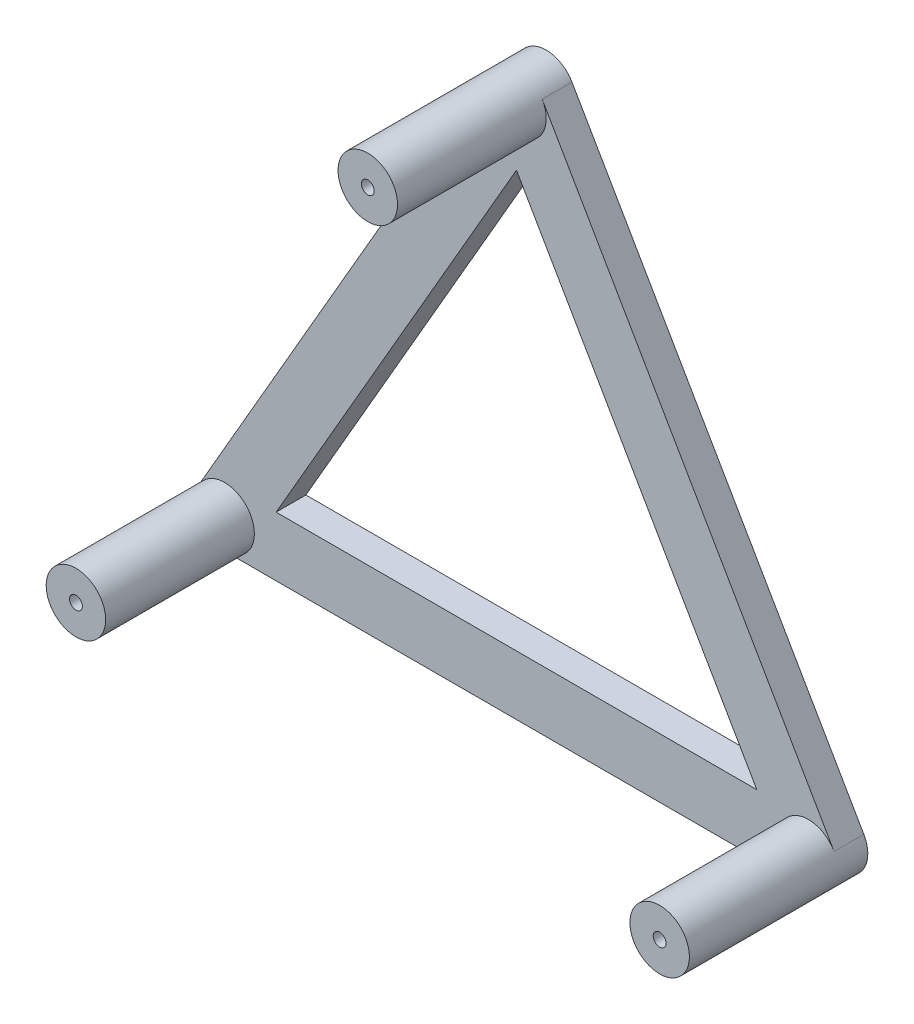
ISO-10303-21;
HEADER;
FILE_DESCRIPTION(('STEP AP214'),'2;1');
FILE_NAME('part.step','',(''),(''),'','','');
FILE_SCHEMA(('AUTOMOTIVE_DESIGN { 1 0 10303 214 1 1 1 1 }'));
ENDSEC;
DATA;
#1=APPLICATION_CONTEXT('core data for automotive mechanical design processes');
#2=APPLICATION_PROTOCOL_DEFINITION('international standard','automotive_design',2000,#1);
#3=PRODUCT_CONTEXT('',#1,'mechanical');
#4=PRODUCT('Part','Part','',(#3));
#5=PRODUCT_RELATED_PRODUCT_CATEGORY('part','',(#4));
#6=PRODUCT_DEFINITION_FORMATION('','',#4);
#7=PRODUCT_DEFINITION_CONTEXT('part definition',#1,'design');
#8=PRODUCT_DEFINITION('design','',#6,#7);
#9=PRODUCT_DEFINITION_SHAPE('','',#8);
#10=(LENGTH_UNIT() NAMED_UNIT(*) SI_UNIT(.MILLI.,.METRE.));
#11=(NAMED_UNIT(*) PLANE_ANGLE_UNIT() SI_UNIT($,.RADIAN.));
#12=(NAMED_UNIT(*) SI_UNIT($,.STERADIAN.) SOLID_ANGLE_UNIT());
#13=UNCERTAINTY_MEASURE_WITH_UNIT(LENGTH_MEASURE(1.E-05),#10,'distance_accuracy_value','');
#14=(GEOMETRIC_REPRESENTATION_CONTEXT(3) GLOBAL_UNCERTAINTY_ASSIGNED_CONTEXT((#13)) GLOBAL_UNIT_ASSIGNED_CONTEXT((#10,
#11,#12)) REPRESENTATION_CONTEXT('',''));
#15=CARTESIAN_POINT('',(0.,0.,0.));
#16=DIRECTION('',(0.,0.,1.));
#17=DIRECTION('',(1.,0.,0.));
#18=AXIS2_PLACEMENT_3D('',#15,#16,#17);
#19=CARTESIAN_POINT('',(0.,0.,3.));
#20=DIRECTION('',(0.,0.,1.));
#21=DIRECTION('',(1.,0.,0.));
#22=AXIS2_PLACEMENT_3D('',#19,#20,#21);
#23=PLANE('',#22);
#24=DIRECTION('',(0.500000000000001,-0.866025403784438,0.));
#25=VECTOR('',#24,1.);
#26=CARTESIAN_POINT('',(12.1243556529822,7.00000000000004,3.));
#27=LINE('',#26,#25);
#28=CARTESIAN_POINT('',(0.,28.,3.));
#29=VERTEX_POINT('',#28);
#30=CARTESIAN_POINT('',(24.2487113059643,-13.9999999999999,3.));
#31=VERTEX_POINT('',#30);
#32=EDGE_CURVE('E178',#29,#31,#27,.T.);
#33=ORIENTED_EDGE('',*,*,#32,.T.);
#34=DIRECTION('',(1.,0.,0.));
#35=VECTOR('',#34,1.);
#36=CARTESIAN_POINT('',(0.,-13.9999999999999,3.));
#37=LINE('',#36,#35);
#38=CARTESIAN_POINT('',(-24.2487113059643,-13.9999999999999,3.));
#39=VERTEX_POINT('',#38);
#40=EDGE_CURVE('E182',#39,#31,#37,.T.);
#41=ORIENTED_EDGE('',*,*,#40,.F.);
#42=DIRECTION('',(-0.500000000000001,-0.866025403784438,0.));
#43=VECTOR('',#42,1.);
#44=CARTESIAN_POINT('',(-12.1243556529822,7.00000000000003,3.));
#45=LINE('',#44,#43);
#46=EDGE_CURVE('E183',#29,#39,#45,.T.);
#47=ORIENTED_EDGE('',*,*,#46,.F.);
#48=EDGE_LOOP('',(#33,#41,#47));
#49=FACE_BOUND('',#48,.T.);
#50=DIRECTION('',(1.,0.,0.));
#51=VECTOR('',#50,1.);
#52=CARTESIAN_POINT('',(0.,-19.9999999999999,3.));
#53=LINE('',#52,#51);
#54=CARTESIAN_POINT('',(-29.4448637286709,-19.9999999999999,3.));
#55=VERTEX_POINT('',#54);
#56=CARTESIAN_POINT('',(29.444863728671,-19.9999999999999,3.));
#57=VERTEX_POINT('',#56);
#58=EDGE_CURVE('E212',#55,#57,#53,.T.);
#59=ORIENTED_EDGE('',*,*,#58,.T.);
#60=CARTESIAN_POINT('',(29.444863728671,-16.9999999999999,3.));
#61=DIRECTION('',(0.,0.,1.));
#62=DIRECTION('',(1.,0.,0.));
#63=AXIS2_PLACEMENT_3D('',#60,#61,#62);
#64=CIRCLE('',#63,3.);
#65=CARTESIAN_POINT('',(32.0429399400243,-15.4999999999999,3.));
#66=VERTEX_POINT('',#65);
#67=EDGE_CURVE('E266',#66,#57,#64,.T.);
#68=ORIENTED_EDGE('',*,*,#67,.F.);
#69=DIRECTION('',(-0.500000000000001,0.866025403784438,0.));
#70=VECTOR('',#69,1.);
#71=CARTESIAN_POINT('',(17.3205080756888,10.,3.));
#72=LINE('',#71,#70);
#73=CARTESIAN_POINT('',(2.59807621135332,35.5,3.));
#74=VERTEX_POINT('',#73);
#75=EDGE_CURVE('E249',#66,#74,#72,.T.);
#76=ORIENTED_EDGE('',*,*,#75,.T.);
#77=CARTESIAN_POINT('',(0.,34.,3.));
#78=DIRECTION('',(0.,0.,1.));
#79=DIRECTION('',(1.,0.,0.));
#80=AXIS2_PLACEMENT_3D('',#77,#78,#79);
#81=CIRCLE('',#80,3.);
#82=CARTESIAN_POINT('',(-2.59807621135332,35.5,3.));
#83=VERTEX_POINT('',#82);
#84=EDGE_CURVE('E239',#83,#74,#81,.T.);
#85=ORIENTED_EDGE('',*,*,#84,.F.);
#86=DIRECTION('',(-0.500000000000001,-0.866025403784438,0.));
#87=VECTOR('',#86,1.);
#88=CARTESIAN_POINT('',(-17.3205080756888,10.,3.));
#89=LINE('',#88,#87);
#90=CARTESIAN_POINT('',(-32.0429399400243,-15.4999999999999,3.));
#91=VERTEX_POINT('',#90);
#92=EDGE_CURVE('E184',#83,#91,#89,.T.);
#93=ORIENTED_EDGE('',*,*,#92,.T.);
#94=CARTESIAN_POINT('',(-29.4448637286709,-16.9999999999999,3.));
#95=DIRECTION('',(0.,0.,1.));
#96=DIRECTION('',(1.,0.,0.));
#97=AXIS2_PLACEMENT_3D('',#94,#95,#96);
#98=CIRCLE('',#97,3.);
#99=EDGE_CURVE('E12',#55,#91,#98,.T.);
#100=ORIENTED_EDGE('',*,*,#99,.F.);
#101=EDGE_LOOP('',(#59,#68,#76,#85,#93,#100));
#102=FACE_BOUND('',#101,.T.);
#103=ADVANCED_FACE('F104',(#49,#102),#23,.T.);
#104=CARTESIAN_POINT('',(0.,-13.9999999999999,3.));
#105=DIRECTION('',(0.,1.,0.));
#106=DIRECTION('',(-1.,0.,0.));
#107=AXIS2_PLACEMENT_3D('',#104,#105,#106);
#108=PLANE('',#107);
#109=DIRECTION('',(1.,0.,0.));
#110=VECTOR('',#109,1.);
#111=CARTESIAN_POINT('',(0.,-13.9999999999999,0.));
#112=LINE('',#111,#110);
#113=CARTESIAN_POINT('',(-24.2487113059643,-13.9999999999999,0.));
#114=VERTEX_POINT('',#113);
#115=CARTESIAN_POINT('',(24.2487113059643,-13.9999999999999,0.));
#116=VERTEX_POINT('',#115);
#117=EDGE_CURVE('E207',#114,#116,#112,.T.);
#118=ORIENTED_EDGE('',*,*,#117,.F.);
#119=DIRECTION('',(0.,0.,-1.));
#120=VECTOR('',#119,1.);
#121=CARTESIAN_POINT('',(-24.2487113059643,-13.9999999999999,3.));
#122=LINE('',#121,#120);
#123=EDGE_CURVE('E153',#39,#114,#122,.T.);
#124=ORIENTED_EDGE('',*,*,#123,.F.);
#125=ORIENTED_EDGE('',*,*,#40,.T.);
#126=DIRECTION('',(0.,0.,-1.));
#127=VECTOR('',#126,1.);
#128=CARTESIAN_POINT('',(24.2487113059643,-13.9999999999999,3.));
#129=LINE('',#128,#127);
#130=EDGE_CURVE('E114',#31,#116,#129,.T.);
#131=ORIENTED_EDGE('',*,*,#130,.T.);
#132=EDGE_LOOP('',(#118,#124,#125,#131));
#133=FACE_BOUND('',#132,.T.);
#134=ADVANCED_FACE('F191',(#133),#108,.T.);
#135=CARTESIAN_POINT('',(-12.1243556529822,7.00000000000003,3.));
#136=DIRECTION('',(0.866025403784438,-0.500000000000001,0.));
#137=DIRECTION('',(0.500000000000001,0.866025403784438,0.));
#138=AXIS2_PLACEMENT_3D('',#135,#136,#137);
#139=PLANE('',#138);
#140=DIRECTION('',(-0.500000000000001,-0.866025403784438,0.));
#141=VECTOR('',#140,1.);
#142=CARTESIAN_POINT('',(-12.1243556529822,7.00000000000003,0.));
#143=LINE('',#142,#141);
#144=CARTESIAN_POINT('',(0.,28.,0.));
#145=VERTEX_POINT('',#144);
#146=EDGE_CURVE('E209',#145,#114,#143,.T.);
#147=ORIENTED_EDGE('',*,*,#146,.F.);
#148=DIRECTION('',(0.,0.,-1.));
#149=VECTOR('',#148,1.);
#150=CARTESIAN_POINT('',(0.,28.,3.));
#151=LINE('',#150,#149);
#152=EDGE_CURVE('E123',#29,#145,#151,.T.);
#153=ORIENTED_EDGE('',*,*,#152,.F.);
#154=ORIENTED_EDGE('',*,*,#46,.T.);
#155=ORIENTED_EDGE('',*,*,#123,.T.);
#156=EDGE_LOOP('',(#147,#153,#154,#155));
#157=FACE_BOUND('',#156,.T.);
#158=ADVANCED_FACE('F329',(#157),#139,.T.);
#159=CARTESIAN_POINT('',(12.1243556529822,7.00000000000004,3.));
#160=DIRECTION('',(0.866025403784438,0.500000000000001,0.));
#161=DIRECTION('',(-0.500000000000001,0.866025403784438,0.));
#162=AXIS2_PLACEMENT_3D('',#159,#160,#161);
#163=PLANE('',#162);
#164=DIRECTION('',(0.500000000000001,-0.866025403784438,0.));
#165=VECTOR('',#164,1.);
#166=CARTESIAN_POINT('',(12.1243556529822,7.00000000000004,0.));
#167=LINE('',#166,#165);
#168=EDGE_CURVE('E187',#145,#116,#167,.T.);
#169=ORIENTED_EDGE('',*,*,#168,.T.);
#170=ORIENTED_EDGE('',*,*,#130,.F.);
#171=ORIENTED_EDGE('',*,*,#32,.F.);
#172=ORIENTED_EDGE('',*,*,#152,.T.);
#173=EDGE_LOOP('',(#169,#170,#171,#172));
#174=FACE_BOUND('',#173,.T.);
#175=ADVANCED_FACE('F186',(#174),#163,.F.);
#176=CARTESIAN_POINT('',(17.3205080756888,10.,3.));
#177=DIRECTION('',(-0.866025403784438,-0.500000000000001,0.));
#178=DIRECTION('',(0.500000000000001,-0.866025403784438,0.));
#179=AXIS2_PLACEMENT_3D('',#176,#177,#178);
#180=PLANE('',#179);
#181=DIRECTION('',(-0.500000000000001,0.866025403784438,0.));
#182=VECTOR('',#181,1.);
#183=CARTESIAN_POINT('',(17.3205080756888,10.,0.));
#184=LINE('',#183,#182);
#185=CARTESIAN_POINT('',(32.0429399400243,-15.4999999999999,0.));
#186=VERTEX_POINT('',#185);
#187=CARTESIAN_POINT('',(2.59807621135332,35.5,0.));
#188=VERTEX_POINT('',#187);
#189=EDGE_CURVE('E199',#186,#188,#184,.T.);
#190=ORIENTED_EDGE('',*,*,#189,.T.);
#191=DIRECTION('',(0.,0.,-1.));
#192=VECTOR('',#191,1.);
#193=CARTESIAN_POINT('',(2.59807621135332,35.5,3.));
#194=LINE('',#193,#192);
#195=EDGE_CURVE('E220',#74,#188,#194,.T.);
#196=ORIENTED_EDGE('',*,*,#195,.F.);
#197=ORIENTED_EDGE('',*,*,#75,.F.);
#198=DIRECTION('',(0.,0.,-1.));
#199=VECTOR('',#198,1.);
#200=CARTESIAN_POINT('',(32.0429399400243,-15.4999999999999,3.));
#201=LINE('',#200,#199);
#202=EDGE_CURVE('E222',#66,#186,#201,.T.);
#203=ORIENTED_EDGE('',*,*,#202,.T.);
#204=EDGE_LOOP('',(#190,#196,#197,#203));
#205=FACE_BOUND('',#204,.T.);
#206=ADVANCED_FACE('F336',(#205),#180,.F.);
#207=CARTESIAN_POINT('',(-17.3205080756888,10.,3.));
#208=DIRECTION('',(0.866025403784438,-0.500000000000001,0.));
#209=DIRECTION('',(0.500000000000001,0.866025403784438,0.));
#210=AXIS2_PLACEMENT_3D('',#207,#208,#209);
#211=PLANE('',#210);
#212=DIRECTION('',(-0.500000000000001,-0.866025403784438,0.));
#213=VECTOR('',#212,1.);
#214=CARTESIAN_POINT('',(-17.3205080756888,10.,0.));
#215=LINE('',#214,#213);
#216=CARTESIAN_POINT('',(-2.59807621135331,35.5,0.));
#217=VERTEX_POINT('',#216);
#218=CARTESIAN_POINT('',(-32.0429399400243,-15.4999999999999,0.));
#219=VERTEX_POINT('',#218);
#220=EDGE_CURVE('E203',#217,#219,#215,.T.);
#221=ORIENTED_EDGE('',*,*,#220,.T.);
#222=DIRECTION('',(0.,0.,-1.));
#223=VECTOR('',#222,1.);
#224=CARTESIAN_POINT('',(-32.0429399400243,-15.4999999999999,3.));
#225=LINE('',#224,#223);
#226=EDGE_CURVE('E216',#91,#219,#225,.T.);
#227=ORIENTED_EDGE('',*,*,#226,.F.);
#228=ORIENTED_EDGE('',*,*,#92,.F.);
#229=DIRECTION('',(0.,0.,-1.));
#230=VECTOR('',#229,1.);
#231=CARTESIAN_POINT('',(-2.59807621135331,35.5,3.));
#232=LINE('',#231,#230);
#233=EDGE_CURVE('E218',#83,#217,#232,.T.);
#234=ORIENTED_EDGE('',*,*,#233,.T.);
#235=EDGE_LOOP('',(#221,#227,#228,#234));
#236=FACE_BOUND('',#235,.T.);
#237=ADVANCED_FACE('F258',(#236),#211,.F.);
#238=CARTESIAN_POINT('',(0.,-19.9999999999999,3.));
#239=DIRECTION('',(0.,1.,0.));
#240=DIRECTION('',(-1.,0.,0.));
#241=AXIS2_PLACEMENT_3D('',#238,#239,#240);
#242=PLANE('',#241);
#243=DIRECTION('',(1.,0.,0.));
#244=VECTOR('',#243,1.);
#245=CARTESIAN_POINT('',(0.,-19.9999999999999,0.));
#246=LINE('',#245,#244);
#247=CARTESIAN_POINT('',(-29.4448637286709,-19.9999999999999,0.));
#248=VERTEX_POINT('',#247);
#249=CARTESIAN_POINT('',(29.444863728671,-19.9999999999999,0.));
#250=VERTEX_POINT('',#249);
#251=EDGE_CURVE('E197',#248,#250,#246,.T.);
#252=ORIENTED_EDGE('',*,*,#251,.T.);
#253=DIRECTION('',(0.,0.,-1.));
#254=VECTOR('',#253,1.);
#255=CARTESIAN_POINT('',(29.444863728671,-19.9999999999999,3.));
#256=LINE('',#255,#254);
#257=EDGE_CURVE('E165',#57,#250,#256,.T.);
#258=ORIENTED_EDGE('',*,*,#257,.F.);
#259=ORIENTED_EDGE('',*,*,#58,.F.);
#260=DIRECTION('',(0.,0.,-1.));
#261=VECTOR('',#260,1.);
#262=CARTESIAN_POINT('',(-29.4448637286709,-19.9999999999999,3.));
#263=LINE('',#262,#261);
#264=EDGE_CURVE('E193',#55,#248,#263,.T.);
#265=ORIENTED_EDGE('',*,*,#264,.T.);
#266=EDGE_LOOP('',(#252,#258,#259,#265));
#267=FACE_BOUND('',#266,.T.);
#268=ADVANCED_FACE('F262',(#267),#242,.F.);
#269=CARTESIAN_POINT('',(0.,0.,0.));
#270=DIRECTION('',(0.,0.,1.));
#271=DIRECTION('',(1.,0.,0.));
#272=AXIS2_PLACEMENT_3D('',#269,#270,#271);
#273=PLANE('',#272);
#274=CARTESIAN_POINT('',(13.6654088139873,-16.9999999999999,0.));
#275=DIRECTION('',(0.,0.,-1.));
#276=DIRECTION('',(-1.,0.,0.));
#277=AXIS2_PLACEMENT_3D('',#274,#275,#276);
#278=CIRCLE('',#277,0.750000000000002);
#279=CARTESIAN_POINT('',(12.9154088139873,-16.9999999999999,0.));
#280=VERTEX_POINT('',#279);
#281=EDGE_CURVE('E305',#280,#280,#278,.T.);
#282=ORIENTED_EDGE('',*,*,#281,.F.);
#283=EDGE_LOOP('',(#282));
#284=FACE_BOUND('',#283,.T.);
#285=CARTESIAN_POINT('',(-13.6654088139873,-16.9999999999999,0.));
#286=DIRECTION('',(0.,0.,-1.));
#287=DIRECTION('',(-1.,0.,0.));
#288=AXIS2_PLACEMENT_3D('',#285,#286,#287);
#289=CIRCLE('',#288,0.750000000000002);
#290=CARTESIAN_POINT('',(-14.4154088139873,-16.9999999999999,0.));
#291=VERTEX_POINT('',#290);
#292=EDGE_CURVE('E302',#291,#291,#289,.T.);
#293=ORIENTED_EDGE('',*,*,#292,.F.);
#294=EDGE_LOOP('',(#293));
#295=FACE_BOUND('',#294,.T.);
#296=CARTESIAN_POINT('',(0.,34.,0.));
#297=DIRECTION('',(0.,0.,-1.));
#298=DIRECTION('',(-1.,0.,0.));
#299=AXIS2_PLACEMENT_3D('',#296,#297,#298);
#300=CIRCLE('',#299,0.75);
#301=CARTESIAN_POINT('',(-0.75,34.,0.));
#302=VERTEX_POINT('',#301);
#303=EDGE_CURVE('E296',#302,#302,#300,.T.);
#304=ORIENTED_EDGE('',*,*,#303,.F.);
#305=EDGE_LOOP('',(#304));
#306=FACE_BOUND('',#305,.T.);
#307=ORIENTED_EDGE('',*,*,#251,.F.);
#308=CARTESIAN_POINT('',(-29.4448637286709,-16.9999999999999,0.));
#309=DIRECTION('',(0.,0.,1.));
#310=DIRECTION('',(1.,0.,0.));
#311=AXIS2_PLACEMENT_3D('',#308,#309,#310);
#312=CIRCLE('',#311,3.);
#313=EDGE_CURVE('E226',#219,#248,#312,.T.);
#314=ORIENTED_EDGE('',*,*,#313,.F.);
#315=ORIENTED_EDGE('',*,*,#220,.F.);
#316=CARTESIAN_POINT('',(0.,34.,0.));
#317=DIRECTION('',(0.,0.,1.));
#318=DIRECTION('',(1.,0.,0.));
#319=AXIS2_PLACEMENT_3D('',#316,#317,#318);
#320=CIRCLE('',#319,3.);
#321=EDGE_CURVE('E200',#188,#217,#320,.T.);
#322=ORIENTED_EDGE('',*,*,#321,.F.);
#323=ORIENTED_EDGE('',*,*,#189,.F.);
#324=CARTESIAN_POINT('',(29.444863728671,-16.9999999999999,0.));
#325=DIRECTION('',(0.,0.,1.));
#326=DIRECTION('',(1.,0.,0.));
#327=AXIS2_PLACEMENT_3D('',#324,#325,#326);
#328=CIRCLE('',#327,3.);
#329=EDGE_CURVE('E108',#250,#186,#328,.T.);
#330=ORIENTED_EDGE('',*,*,#329,.F.);
#331=EDGE_LOOP('',(#307,#314,#315,#322,#323,#330));
#332=FACE_BOUND('',#331,.T.);
#333=ORIENTED_EDGE('',*,*,#168,.F.);
#334=ORIENTED_EDGE('',*,*,#146,.T.);
#335=ORIENTED_EDGE('',*,*,#117,.T.);
#336=EDGE_LOOP('',(#333,#334,#335));
#337=FACE_BOUND('',#336,.T.);
#338=ADVANCED_FACE('F320',(#284,#295,#306,#332,#337),#273,.F.);
#339=CARTESIAN_POINT('',(29.444863728671,-16.9999999999999,3.));
#340=DIRECTION('',(0.,0.,-1.));
#341=DIRECTION('',(-1.,0.,0.));
#342=AXIS2_PLACEMENT_3D('',#339,#340,#341);
#343=CYLINDRICAL_SURFACE('',#342,3.);
#344=ORIENTED_EDGE('',*,*,#202,.F.);
#345=ORIENTED_EDGE('',*,*,#67,.T.);
#346=ORIENTED_EDGE('',*,*,#257,.T.);
#347=ORIENTED_EDGE('',*,*,#329,.T.);
#348=EDGE_LOOP('',(#344,#345,#346,#347));
#349=FACE_BOUND('',#348,.T.);
#350=CARTESIAN_POINT('',(29.444863728671,-16.9999999999999,18.));
#351=DIRECTION('',(0.,0.,1.));
#352=DIRECTION('',(1.,0.,0.));
#353=AXIS2_PLACEMENT_3D('',#350,#351,#352);
#354=CIRCLE('',#353,3.);
#355=CARTESIAN_POINT('',(32.444863728671,-16.9999999999999,18.));
#356=VERTEX_POINT('',#355);
#357=EDGE_CURVE('E268',#356,#356,#354,.T.);
#358=ORIENTED_EDGE('',*,*,#357,.F.);
#359=EDGE_LOOP('',(#358));
#360=FACE_BOUND('',#359,.T.);
#361=ADVANCED_FACE('F106',(#349,#360),#343,.T.);
#362=CARTESIAN_POINT('',(-29.4448637286709,-16.9999999999999,3.));
#363=DIRECTION('',(0.,0.,-1.));
#364=DIRECTION('',(-1.,0.,0.));
#365=AXIS2_PLACEMENT_3D('',#362,#363,#364);
#366=CYLINDRICAL_SURFACE('',#365,3.);
#367=ORIENTED_EDGE('',*,*,#264,.F.);
#368=ORIENTED_EDGE('',*,*,#99,.T.);
#369=ORIENTED_EDGE('',*,*,#226,.T.);
#370=ORIENTED_EDGE('',*,*,#313,.T.);
#371=EDGE_LOOP('',(#367,#368,#369,#370));
#372=FACE_BOUND('',#371,.T.);
#373=CARTESIAN_POINT('',(-29.4448637286709,-16.9999999999999,18.));
#374=DIRECTION('',(0.,0.,1.));
#375=DIRECTION('',(1.,0.,0.));
#376=AXIS2_PLACEMENT_3D('',#373,#374,#375);
#377=CIRCLE('',#376,3.);
#378=CARTESIAN_POINT('',(-26.4448637286709,-16.9999999999999,18.));
#379=VERTEX_POINT('',#378);
#380=EDGE_CURVE('E233',#379,#379,#377,.T.);
#381=ORIENTED_EDGE('',*,*,#380,.F.);
#382=EDGE_LOOP('',(#381));
#383=FACE_BOUND('',#382,.T.);
#384=ADVANCED_FACE('F260',(#372,#383),#366,.T.);
#385=CARTESIAN_POINT('',(0.,34.,3.));
#386=DIRECTION('',(0.,0.,-1.));
#387=DIRECTION('',(-1.,0.,0.));
#388=AXIS2_PLACEMENT_3D('',#385,#386,#387);
#389=CYLINDRICAL_SURFACE('',#388,3.);
#390=ORIENTED_EDGE('',*,*,#233,.F.);
#391=ORIENTED_EDGE('',*,*,#84,.T.);
#392=ORIENTED_EDGE('',*,*,#195,.T.);
#393=ORIENTED_EDGE('',*,*,#321,.T.);
#394=EDGE_LOOP('',(#390,#391,#392,#393));
#395=FACE_BOUND('',#394,.T.);
#396=CARTESIAN_POINT('',(0.,34.,18.));
#397=DIRECTION('',(0.,0.,1.));
#398=DIRECTION('',(1.,0.,0.));
#399=AXIS2_PLACEMENT_3D('',#396,#397,#398);
#400=CIRCLE('',#399,3.);
#401=CARTESIAN_POINT('',(3.,34.,18.));
#402=VERTEX_POINT('',#401);
#403=EDGE_CURVE('E244',#402,#402,#400,.T.);
#404=ORIENTED_EDGE('',*,*,#403,.F.);
#405=EDGE_LOOP('',(#404));
#406=FACE_BOUND('',#405,.T.);
#407=ADVANCED_FACE('F348',(#395,#406),#389,.T.);
#408=CARTESIAN_POINT('',(-29.4448637286709,-16.9999999999999,18.));
#409=DIRECTION('',(0.,0.,1.));
#410=DIRECTION('',(1.,0.,0.));
#411=AXIS2_PLACEMENT_3D('',#408,#409,#410);
#412=PLANE('',#411);
#413=CARTESIAN_POINT('',(-29.4448637286709,-16.9999999999999,18.));
#414=DIRECTION('',(0.,0.,1.));
#415=DIRECTION('',(1.,0.,0.));
#416=AXIS2_PLACEMENT_3D('',#413,#414,#415);
#417=CIRCLE('',#416,0.650000000000001);
#418=CARTESIAN_POINT('',(-28.7948637286709,-16.9999999999999,18.));
#419=VERTEX_POINT('',#418);
#420=EDGE_CURVE('E285',#419,#419,#417,.T.);
#421=ORIENTED_EDGE('',*,*,#420,.F.);
#422=EDGE_LOOP('',(#421));
#423=FACE_BOUND('',#422,.T.);
#424=ORIENTED_EDGE('',*,*,#380,.T.);
#425=EDGE_LOOP('',(#424));
#426=FACE_BOUND('',#425,.T.);
#427=ADVANCED_FACE('F344',(#423,#426),#412,.T.);
#428=CARTESIAN_POINT('',(0.,34.,18.));
#429=DIRECTION('',(0.,0.,1.));
#430=DIRECTION('',(1.,0.,0.));
#431=AXIS2_PLACEMENT_3D('',#428,#429,#430);
#432=PLANE('',#431);
#433=CARTESIAN_POINT('',(0.,34.,18.));
#434=DIRECTION('',(0.,0.,1.));
#435=DIRECTION('',(1.,0.,0.));
#436=AXIS2_PLACEMENT_3D('',#433,#434,#435);
#437=CIRCLE('',#436,0.649999999999999);
#438=CARTESIAN_POINT('',(0.649999999999999,34.,18.));
#439=VERTEX_POINT('',#438);
#440=EDGE_CURVE('E288',#439,#439,#437,.T.);
#441=ORIENTED_EDGE('',*,*,#440,.F.);
#442=EDGE_LOOP('',(#441));
#443=FACE_BOUND('',#442,.T.);
#444=ORIENTED_EDGE('',*,*,#403,.T.);
#445=EDGE_LOOP('',(#444));
#446=FACE_BOUND('',#445,.T.);
#447=ADVANCED_FACE('F347',(#443,#446),#432,.T.);
#448=CARTESIAN_POINT('',(29.444863728671,-16.9999999999999,18.));
#449=DIRECTION('',(0.,0.,1.));
#450=DIRECTION('',(1.,0.,0.));
#451=AXIS2_PLACEMENT_3D('',#448,#449,#450);
#452=PLANE('',#451);
#453=CARTESIAN_POINT('',(29.444863728671,-16.9999999999999,18.));
#454=DIRECTION('',(0.,0.,1.));
#455=DIRECTION('',(1.,0.,0.));
#456=AXIS2_PLACEMENT_3D('',#453,#454,#455);
#457=CIRCLE('',#456,0.650000000000001);
#458=CARTESIAN_POINT('',(30.094863728671,-16.9999999999999,18.));
#459=VERTEX_POINT('',#458);
#460=EDGE_CURVE('E278',#459,#459,#457,.T.);
#461=ORIENTED_EDGE('',*,*,#460,.F.);
#462=EDGE_LOOP('',(#461));
#463=FACE_BOUND('',#462,.T.);
#464=ORIENTED_EDGE('',*,*,#357,.T.);
#465=EDGE_LOOP('',(#464));
#466=FACE_BOUND('',#465,.T.);
#467=ADVANCED_FACE('F352',(#463,#466),#452,.T.);
#468=CARTESIAN_POINT('',(29.444863728671,-16.9999999999999,16.));
#469=DIRECTION('',(0.,0.,1.));
#470=DIRECTION('',(1.,0.,0.));
#471=AXIS2_PLACEMENT_3D('',#468,#469,#470);
#472=CYLINDRICAL_SURFACE('',#471,0.650000000000001);
#473=CARTESIAN_POINT('',(29.444863728671,-16.9999999999999,16.));
#474=DIRECTION('',(0.,0.,1.));
#475=DIRECTION('',(1.,0.,0.));
#476=AXIS2_PLACEMENT_3D('',#473,#474,#475);
#477=CIRCLE('',#476,0.650000000000001);
#478=CARTESIAN_POINT('',(30.094863728671,-16.9999999999999,16.));
#479=VERTEX_POINT('',#478);
#480=EDGE_CURVE('E275',#479,#479,#477,.T.);
#481=ORIENTED_EDGE('',*,*,#480,.F.);
#482=EDGE_LOOP('',(#481));
#483=FACE_BOUND('',#482,.T.);
#484=ORIENTED_EDGE('',*,*,#460,.T.);
#485=EDGE_LOOP('',(#484));
#486=FACE_BOUND('',#485,.T.);
#487=ADVANCED_FACE('F356',(#483,#486),#472,.F.);
#488=CARTESIAN_POINT('',(29.444863728671,-16.9999999999999,16.));
#489=DIRECTION('',(0.,0.,1.));
#490=DIRECTION('',(1.,0.,0.));
#491=AXIS2_PLACEMENT_3D('',#488,#489,#490);
#492=PLANE('',#491);
#493=ORIENTED_EDGE('',*,*,#480,.T.);
#494=EDGE_LOOP('',(#493));
#495=FACE_BOUND('',#494,.T.);
#496=ADVANCED_FACE('F358',(#495),#492,.T.);
#497=CARTESIAN_POINT('',(0.,34.,16.));
#498=DIRECTION('',(0.,0.,1.));
#499=DIRECTION('',(1.,0.,0.));
#500=AXIS2_PLACEMENT_3D('',#497,#498,#499);
#501=CYLINDRICAL_SURFACE('',#500,0.649999999999999);
#502=CARTESIAN_POINT('',(0.,34.,16.));
#503=DIRECTION('',(0.,0.,1.));
#504=DIRECTION('',(1.,0.,0.));
#505=AXIS2_PLACEMENT_3D('',#502,#503,#504);
#506=CIRCLE('',#505,0.649999999999999);
#507=CARTESIAN_POINT('',(0.649999999999999,34.,16.));
#508=VERTEX_POINT('',#507);
#509=EDGE_CURVE('E272',#508,#508,#506,.T.);
#510=ORIENTED_EDGE('',*,*,#509,.F.);
#511=EDGE_LOOP('',(#510));
#512=FACE_BOUND('',#511,.T.);
#513=ORIENTED_EDGE('',*,*,#440,.T.);
#514=EDGE_LOOP('',(#513));
#515=FACE_BOUND('',#514,.T.);
#516=ADVANCED_FACE('F361',(#512,#515),#501,.F.);
#517=CARTESIAN_POINT('',(0.,34.,16.));
#518=DIRECTION('',(0.,0.,1.));
#519=DIRECTION('',(1.,0.,0.));
#520=AXIS2_PLACEMENT_3D('',#517,#518,#519);
#521=PLANE('',#520);
#522=ORIENTED_EDGE('',*,*,#509,.T.);
#523=EDGE_LOOP('',(#522));
#524=FACE_BOUND('',#523,.T.);
#525=ADVANCED_FACE('F374',(#524),#521,.T.);
#526=CARTESIAN_POINT('',(-29.4448637286709,-16.9999999999999,16.));
#527=DIRECTION('',(0.,0.,1.));
#528=DIRECTION('',(1.,0.,0.));
#529=AXIS2_PLACEMENT_3D('',#526,#527,#528);
#530=CYLINDRICAL_SURFACE('',#529,0.650000000000001);
#531=CARTESIAN_POINT('',(-29.4448637286709,-16.9999999999999,16.));
#532=DIRECTION('',(0.,0.,1.));
#533=DIRECTION('',(1.,0.,0.));
#534=AXIS2_PLACEMENT_3D('',#531,#532,#533);
#535=CIRCLE('',#534,0.650000000000001);
#536=CARTESIAN_POINT('',(-28.7948637286709,-16.9999999999999,16.));
#537=VERTEX_POINT('',#536);
#538=EDGE_CURVE('E282',#537,#537,#535,.T.);
#539=ORIENTED_EDGE('',*,*,#538,.F.);
#540=EDGE_LOOP('',(#539));
#541=FACE_BOUND('',#540,.T.);
#542=ORIENTED_EDGE('',*,*,#420,.T.);
#543=EDGE_LOOP('',(#542));
#544=FACE_BOUND('',#543,.T.);
#545=ADVANCED_FACE('F370',(#541,#544),#530,.F.);
#546=CARTESIAN_POINT('',(-29.4448637286709,-16.9999999999999,16.));
#547=DIRECTION('',(0.,0.,1.));
#548=DIRECTION('',(1.,0.,0.));
#549=AXIS2_PLACEMENT_3D('',#546,#547,#548);
#550=PLANE('',#549);
#551=ORIENTED_EDGE('',*,*,#538,.T.);
#552=EDGE_LOOP('',(#551));
#553=FACE_BOUND('',#552,.T.);
#554=ADVANCED_FACE('F366',(#553),#550,.T.);
#555=CARTESIAN_POINT('',(0.,34.,2.));
#556=DIRECTION('',(0.,0.,-1.));
#557=DIRECTION('',(-1.,0.,0.));
#558=AXIS2_PLACEMENT_3D('',#555,#556,#557);
#559=CYLINDRICAL_SURFACE('',#558,0.75);
#560=CARTESIAN_POINT('',(0.,34.,2.));
#561=DIRECTION('',(0.,0.,-1.));
#562=DIRECTION('',(-1.,0.,0.));
#563=AXIS2_PLACEMENT_3D('',#560,#561,#562);
#564=CIRCLE('',#563,0.75);
#565=CARTESIAN_POINT('',(-0.75,34.,2.));
#566=VERTEX_POINT('',#565);
#567=EDGE_CURVE('E293',#566,#566,#564,.T.);
#568=ORIENTED_EDGE('',*,*,#567,.F.);
#569=EDGE_LOOP('',(#568));
#570=FACE_BOUND('',#569,.T.);
#571=ORIENTED_EDGE('',*,*,#303,.T.);
#572=EDGE_LOOP('',(#571));
#573=FACE_BOUND('',#572,.T.);
#574=ADVANCED_FACE('F369',(#570,#573),#559,.F.);
#575=CARTESIAN_POINT('',(0.,34.,2.));
#576=DIRECTION('',(0.,0.,-1.));
#577=DIRECTION('',(-1.,0.,0.));
#578=AXIS2_PLACEMENT_3D('',#575,#576,#577);
#579=PLANE('',#578);
#580=ORIENTED_EDGE('',*,*,#567,.T.);
#581=EDGE_LOOP('',(#580));
#582=FACE_BOUND('',#581,.T.);
#583=ADVANCED_FACE('F382',(#582),#579,.T.);
#584=CARTESIAN_POINT('',(-13.6654088139873,-16.9999999999999,2.));
#585=DIRECTION('',(0.,0.,-1.));
#586=DIRECTION('',(-1.,0.,0.));
#587=AXIS2_PLACEMENT_3D('',#584,#585,#586);
#588=CYLINDRICAL_SURFACE('',#587,0.750000000000002);
#589=CARTESIAN_POINT('',(-13.6654088139873,-16.9999999999999,2.));
#590=DIRECTION('',(0.,0.,-1.));
#591=DIRECTION('',(-1.,0.,0.));
#592=AXIS2_PLACEMENT_3D('',#589,#590,#591);
#593=CIRCLE('',#592,0.750000000000002);
#594=CARTESIAN_POINT('',(-14.4154088139873,-16.9999999999999,2.));
#595=VERTEX_POINT('',#594);
#596=EDGE_CURVE('E299',#595,#595,#593,.T.);
#597=ORIENTED_EDGE('',*,*,#596,.F.);
#598=EDGE_LOOP('',(#597));
#599=FACE_BOUND('',#598,.T.);
#600=ORIENTED_EDGE('',*,*,#292,.T.);
#601=EDGE_LOOP('',(#600));
#602=FACE_BOUND('',#601,.T.);
#603=ADVANCED_FACE('F385',(#599,#602),#588,.F.);
#604=CARTESIAN_POINT('',(-13.6654088139873,-16.9999999999999,2.));
#605=DIRECTION('',(0.,0.,-1.));
#606=DIRECTION('',(-1.,0.,0.));
#607=AXIS2_PLACEMENT_3D('',#604,#605,#606);
#608=PLANE('',#607);
#609=ORIENTED_EDGE('',*,*,#596,.T.);
#610=EDGE_LOOP('',(#609));
#611=FACE_BOUND('',#610,.T.);
#612=ADVANCED_FACE('F316',(#611),#608,.T.);
#613=CARTESIAN_POINT('',(13.6654088139873,-16.9999999999999,2.));
#614=DIRECTION('',(0.,0.,-1.));
#615=DIRECTION('',(-1.,0.,0.));
#616=AXIS2_PLACEMENT_3D('',#613,#614,#615);
#617=CYLINDRICAL_SURFACE('',#616,0.750000000000002);
#618=CARTESIAN_POINT('',(13.6654088139873,-16.9999999999999,2.));
#619=DIRECTION('',(0.,0.,-1.));
#620=DIRECTION('',(-1.,0.,0.));
#621=AXIS2_PLACEMENT_3D('',#618,#619,#620);
#622=CIRCLE('',#621,0.750000000000002);
#623=CARTESIAN_POINT('',(12.9154088139873,-16.9999999999999,2.));
#624=VERTEX_POINT('',#623);
#625=EDGE_CURVE('E279',#624,#624,#622,.T.);
#626=ORIENTED_EDGE('',*,*,#625,.F.);
#627=EDGE_LOOP('',(#626));
#628=FACE_BOUND('',#627,.T.);
#629=ORIENTED_EDGE('',*,*,#281,.T.);
#630=EDGE_LOOP('',(#629));
#631=FACE_BOUND('',#630,.T.);
#632=ADVANCED_FACE('F313',(#628,#631),#617,.F.);
#633=CARTESIAN_POINT('',(13.6654088139873,-16.9999999999999,2.));
#634=DIRECTION('',(0.,0.,-1.));
#635=DIRECTION('',(-1.,0.,0.));
#636=AXIS2_PLACEMENT_3D('',#633,#634,#635);
#637=PLANE('',#636);
#638=ORIENTED_EDGE('',*,*,#625,.T.);
#639=EDGE_LOOP('',(#638));
#640=FACE_BOUND('',#639,.T.);
#641=ADVANCED_FACE('F311',(#640),#637,.T.);
#642=CLOSED_SHELL('',(#103,#134,#158,#175,#206,#237,#268,#338,#361,#384,#407,#427,#447,#467,
#487,#496,#516,#525,#545,#554,#574,#583,#603,#612,#632,#641));
#643=MANIFOLD_SOLID_BREP('B2',#642);
#644=ADVANCED_BREP_SHAPE_REPRESENTATION('',(#18,#643),#14);
#645=SHAPE_DEFINITION_REPRESENTATION(#9,#644);
ENDSEC;
END-ISO-10303-21;
